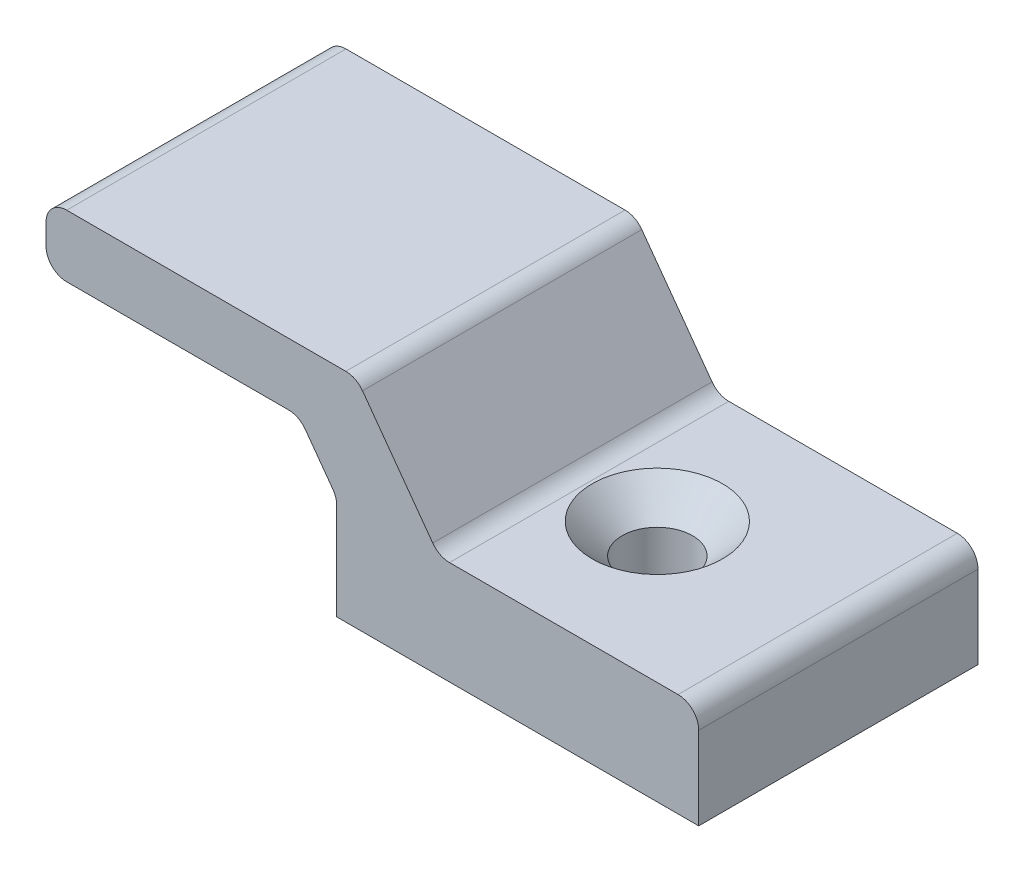
ISO-10303-21;
HEADER;
FILE_DESCRIPTION(('STEP AP214'),'2;1');
FILE_NAME('part.step','',(''),(''),'','','');
FILE_SCHEMA(('AUTOMOTIVE_DESIGN { 1 0 10303 214 1 1 1 1 }'));
ENDSEC;
DATA;
#1=APPLICATION_CONTEXT('core data for automotive mechanical design processes');
#2=APPLICATION_PROTOCOL_DEFINITION('international standard','automotive_design',2000,#1);
#3=PRODUCT_CONTEXT('',#1,'mechanical');
#4=PRODUCT('Part','Part','',(#3));
#5=PRODUCT_RELATED_PRODUCT_CATEGORY('part','',(#4));
#6=PRODUCT_DEFINITION_FORMATION('','',#4);
#7=PRODUCT_DEFINITION_CONTEXT('part definition',#1,'design');
#8=PRODUCT_DEFINITION('design','',#6,#7);
#9=PRODUCT_DEFINITION_SHAPE('','',#8);
#10=(LENGTH_UNIT() NAMED_UNIT(*) SI_UNIT(.MILLI.,.METRE.));
#11=(NAMED_UNIT(*) PLANE_ANGLE_UNIT() SI_UNIT($,.RADIAN.));
#12=(NAMED_UNIT(*) SI_UNIT($,.STERADIAN.) SOLID_ANGLE_UNIT());
#13=UNCERTAINTY_MEASURE_WITH_UNIT(LENGTH_MEASURE(1.E-05),#10,'distance_accuracy_value','');
#14=(GEOMETRIC_REPRESENTATION_CONTEXT(3) GLOBAL_UNCERTAINTY_ASSIGNED_CONTEXT((#13)) GLOBAL_UNIT_ASSIGNED_CONTEXT((#10,
#11,#12)) REPRESENTATION_CONTEXT('',''));
#15=CARTESIAN_POINT('',(0.,0.,0.));
#16=DIRECTION('',(0.,0.,1.));
#17=DIRECTION('',(1.,0.,0.));
#18=AXIS2_PLACEMENT_3D('',#15,#16,#17);
#19=CARTESIAN_POINT('',(8.75,5.,13.5));
#20=DIRECTION('',(-1.,0.,0.));
#21=DIRECTION('',(0.,-1.,0.));
#22=AXIS2_PLACEMENT_3D('',#19,#20,#21);
#23=PLANE('',#22);
#24=DIRECTION('',(0.,1.,0.));
#25=VECTOR('',#24,1.);
#26=CARTESIAN_POINT('',(8.75,5.,0.));
#27=LINE('',#26,#25);
#28=CARTESIAN_POINT('',(8.75,0.,0.));
#29=VERTEX_POINT('',#28);
#30=CARTESIAN_POINT('',(8.75,4.,0.));
#31=VERTEX_POINT('',#30);
#32=EDGE_CURVE('E185',#29,#31,#27,.T.);
#33=ORIENTED_EDGE('',*,*,#32,.T.);
#34=DIRECTION('',(0.,0.,-1.));
#35=VECTOR('',#34,1.);
#36=CARTESIAN_POINT('',(8.75,4.,13.5));
#37=LINE('',#36,#35);
#38=CARTESIAN_POINT('',(8.75,4.,13.5));
#39=VERTEX_POINT('',#38);
#40=EDGE_CURVE('E277',#31,#39,#37,.F.);
#41=ORIENTED_EDGE('',*,*,#40,.T.);
#42=DIRECTION('',(0.,1.,0.));
#43=VECTOR('',#42,1.);
#44=CARTESIAN_POINT('',(8.75,5.,13.5));
#45=LINE('',#44,#43);
#46=CARTESIAN_POINT('',(8.75,0.,13.5));
#47=VERTEX_POINT('',#46);
#48=EDGE_CURVE('E217',#47,#39,#45,.T.);
#49=ORIENTED_EDGE('',*,*,#48,.F.);
#50=DIRECTION('',(0.,0.,-1.));
#51=VECTOR('',#50,1.);
#52=CARTESIAN_POINT('',(8.75,0.,13.5));
#53=LINE('',#52,#51);
#54=EDGE_CURVE('E174',#47,#29,#53,.T.);
#55=ORIENTED_EDGE('',*,*,#54,.T.);
#56=EDGE_LOOP('',(#33,#41,#49,#55));
#57=FACE_BOUND('',#56,.T.);
#58=ADVANCED_FACE('F39',(#57),#23,.F.);
#59=CARTESIAN_POINT('',(-3.80700582833205,5.,13.5));
#60=DIRECTION('',(0.,-1.,0.));
#61=DIRECTION('',(0.,0.,-1.));
#62=AXIS2_PLACEMENT_3D('',#59,#60,#61);
#63=PLANE('',#62);
#64=CARTESIAN_POINT('',(0.,5.00000000000001,6.75));
#65=DIRECTION('',(0.,1.,0.));
#66=DIRECTION('',(0.,0.,1.));
#67=AXIS2_PLACEMENT_3D('',#64,#65,#66);
#68=CIRCLE('',#67,3.15);
#69=CARTESIAN_POINT('',(0.,5.00000000000001,9.9));
#70=VERTEX_POINT('',#69);
#71=EDGE_CURVE('E357',#70,#70,#68,.T.);
#72=ORIENTED_EDGE('',*,*,#71,.F.);
#73=EDGE_LOOP('',(#72));
#74=FACE_BOUND('',#73,.T.);
#75=DIRECTION('',(-1.,0.,0.));
#76=VECTOR('',#75,1.);
#77=CARTESIAN_POINT('',(-3.80700582833205,5.,13.5));
#78=LINE('',#77,#76);
#79=CARTESIAN_POINT('',(7.74999999999999,5.,13.5));
#80=VERTEX_POINT('',#79);
#81=CARTESIAN_POINT('',(-3.29725622571832,5.,13.5));
#82=VERTEX_POINT('',#81);
#83=EDGE_CURVE('E318',#80,#82,#78,.T.);
#84=ORIENTED_EDGE('',*,*,#83,.F.);
#85=DIRECTION('',(0.,0.,-1.));
#86=VECTOR('',#85,1.);
#87=CARTESIAN_POINT('',(7.75,5.,13.5));
#88=LINE('',#87,#86);
#89=CARTESIAN_POINT('',(7.74999999999999,5.,0.));
#90=VERTEX_POINT('',#89);
#91=EDGE_CURVE('E273',#80,#90,#88,.T.);
#92=ORIENTED_EDGE('',*,*,#91,.T.);
#93=DIRECTION('',(-1.,0.,0.));
#94=VECTOR('',#93,1.);
#95=CARTESIAN_POINT('',(-3.80700582833205,5.,0.));
#96=LINE('',#95,#94);
#97=CARTESIAN_POINT('',(-3.29725622571832,5.,0.));
#98=VERTEX_POINT('',#97);
#99=EDGE_CURVE('E189',#90,#98,#96,.T.);
#100=ORIENTED_EDGE('',*,*,#99,.T.);
#101=DIRECTION('',(0.,0.,-1.));
#102=VECTOR('',#101,1.);
#103=CARTESIAN_POINT('',(-3.29725622571832,5.,13.5));
#104=LINE('',#103,#102);
#105=EDGE_CURVE('E270',#98,#82,#104,.F.);
#106=ORIENTED_EDGE('',*,*,#105,.T.);
#107=EDGE_LOOP('',(#84,#92,#100,#106));
#108=FACE_BOUND('',#107,.T.);
#109=ADVANCED_FACE('F310',(#74,#108),#63,.F.);
#110=CARTESIAN_POINT('',(-7.80000000000001,10.5,13.5));
#111=DIRECTION('',(-0.809226121067879,-0.587497306361003,0.));
#112=DIRECTION('',(0.587497306361003,-0.809226121067879,0.));
#113=AXIS2_PLACEMENT_3D('',#110,#111,#112);
#114=PLANE('',#113);
#115=DIRECTION('',(-0.587497306361003,0.809226121067879,0.));
#116=VECTOR('',#115,1.);
#117=CARTESIAN_POINT('',(-7.80000000000001,10.5,0.));
#118=LINE('',#117,#116);
#119=CARTESIAN_POINT('',(-4.1064823467862,5.412502693639,0.));
#120=VERTEX_POINT('',#119);
#121=CARTESIAN_POINT('',(-7.50052348154585,10.087497306361,0.));
#122=VERTEX_POINT('',#121);
#123=EDGE_CURVE('E194',#120,#122,#118,.T.);
#124=ORIENTED_EDGE('',*,*,#123,.T.);
#125=DIRECTION('',(0.,0.,-1.));
#126=VECTOR('',#125,1.);
#127=CARTESIAN_POINT('',(-7.50052348154585,10.087497306361,13.5));
#128=LINE('',#127,#126);
#129=CARTESIAN_POINT('',(-7.50052348154585,10.087497306361,13.5));
#130=VERTEX_POINT('',#129);
#131=EDGE_CURVE('E267',#122,#130,#128,.F.);
#132=ORIENTED_EDGE('',*,*,#131,.T.);
#133=DIRECTION('',(-0.587497306361003,0.809226121067879,0.));
#134=VECTOR('',#133,1.);
#135=CARTESIAN_POINT('',(-7.80000000000001,10.5,13.5));
#136=LINE('',#135,#134);
#137=CARTESIAN_POINT('',(-4.1064823467862,5.412502693639,13.5));
#138=VERTEX_POINT('',#137);
#139=EDGE_CURVE('E316',#138,#130,#136,.T.);
#140=ORIENTED_EDGE('',*,*,#139,.F.);
#141=DIRECTION('',(0.,0.,-1.));
#142=VECTOR('',#141,1.);
#143=CARTESIAN_POINT('',(-4.1064823467862,5.412502693639,0.));
#144=LINE('',#143,#142);
#145=EDGE_CURVE('E263',#138,#120,#144,.T.);
#146=ORIENTED_EDGE('',*,*,#145,.T.);
#147=EDGE_LOOP('',(#124,#132,#140,#146));
#148=FACE_BOUND('',#147,.T.);
#149=ADVANCED_FACE('F320',(#148),#114,.F.);
#150=CARTESIAN_POINT('',(-22.8,10.5,13.5));
#151=DIRECTION('',(0.,-1.,0.));
#152=DIRECTION('',(1.,0.,0.));
#153=AXIS2_PLACEMENT_3D('',#150,#151,#152);
#154=PLANE('',#153);
#155=DIRECTION('',(-1.,0.,0.));
#156=VECTOR('',#155,1.);
#157=CARTESIAN_POINT('',(-22.8,10.5,0.));
#158=LINE('',#157,#156);
#159=CARTESIAN_POINT('',(-8.30974960261373,10.5,0.));
#160=VERTEX_POINT('',#159);
#161=CARTESIAN_POINT('',(-21.8,10.5,0.));
#162=VERTEX_POINT('',#161);
#163=EDGE_CURVE('E198',#160,#162,#158,.T.);
#164=ORIENTED_EDGE('',*,*,#163,.T.);
#165=DIRECTION('',(0.,0.,-1.));
#166=VECTOR('',#165,1.);
#167=CARTESIAN_POINT('',(-21.8,10.5,13.5));
#168=LINE('',#167,#166);
#169=CARTESIAN_POINT('',(-21.8,10.5,13.5));
#170=VERTEX_POINT('',#169);
#171=EDGE_CURVE('E260',#162,#170,#168,.F.);
#172=ORIENTED_EDGE('',*,*,#171,.T.);
#173=DIRECTION('',(-1.,0.,0.));
#174=VECTOR('',#173,1.);
#175=CARTESIAN_POINT('',(-22.8,10.5,13.5));
#176=LINE('',#175,#174);
#177=CARTESIAN_POINT('',(-8.30974960261373,10.5,13.5));
#178=VERTEX_POINT('',#177);
#179=EDGE_CURVE('E323',#178,#170,#176,.T.);
#180=ORIENTED_EDGE('',*,*,#179,.F.);
#181=DIRECTION('',(0.,0.,-1.));
#182=VECTOR('',#181,1.);
#183=CARTESIAN_POINT('',(-8.30974960261373,10.5,13.5));
#184=LINE('',#183,#182);
#185=EDGE_CURVE('E256',#178,#160,#184,.T.);
#186=ORIENTED_EDGE('',*,*,#185,.T.);
#187=EDGE_LOOP('',(#164,#172,#180,#186));
#188=FACE_BOUND('',#187,.T.);
#189=ADVANCED_FACE('F370',(#188),#154,.F.);
#190=CARTESIAN_POINT('',(-22.8,7.5,13.5));
#191=DIRECTION('',(1.,0.,0.));
#192=DIRECTION('',(0.,0.,-1.));
#193=AXIS2_PLACEMENT_3D('',#190,#191,#192);
#194=PLANE('',#193);
#195=DIRECTION('',(0.,-1.,0.));
#196=VECTOR('',#195,1.);
#197=CARTESIAN_POINT('',(-22.8,7.5,0.));
#198=LINE('',#197,#196);
#199=CARTESIAN_POINT('',(-22.8,9.5,0.));
#200=VERTEX_POINT('',#199);
#201=CARTESIAN_POINT('',(-22.8,8.5,0.));
#202=VERTEX_POINT('',#201);
#203=EDGE_CURVE('E202',#200,#202,#198,.T.);
#204=ORIENTED_EDGE('',*,*,#203,.T.);
#205=DIRECTION('',(0.,0.,-1.));
#206=VECTOR('',#205,1.);
#207=CARTESIAN_POINT('',(-22.8,8.5,13.5));
#208=LINE('',#207,#206);
#209=CARTESIAN_POINT('',(-22.8,8.5,13.5));
#210=VERTEX_POINT('',#209);
#211=EDGE_CURVE('E241',#202,#210,#208,.F.);
#212=ORIENTED_EDGE('',*,*,#211,.T.);
#213=DIRECTION('',(0.,-1.,0.));
#214=VECTOR('',#213,1.);
#215=CARTESIAN_POINT('',(-22.8,7.5,13.5));
#216=LINE('',#215,#214);
#217=CARTESIAN_POINT('',(-22.8,9.5,13.5));
#218=VERTEX_POINT('',#217);
#219=EDGE_CURVE('E328',#218,#210,#216,.T.);
#220=ORIENTED_EDGE('',*,*,#219,.F.);
#221=DIRECTION('',(0.,0.,-1.));
#222=VECTOR('',#221,1.);
#223=CARTESIAN_POINT('',(-22.8,9.5,13.5));
#224=LINE('',#223,#222);
#225=EDGE_CURVE('E237',#218,#200,#224,.T.);
#226=ORIENTED_EDGE('',*,*,#225,.T.);
#227=EDGE_LOOP('',(#204,#212,#220,#226));
#228=FACE_BOUND('',#227,.T.);
#229=ADVANCED_FACE('F409',(#228),#194,.F.);
#230=CARTESIAN_POINT('',(-10.5649973507582,7.5,13.5));
#231=DIRECTION('',(0.,1.,0.));
#232=DIRECTION('',(-1.,0.,0.));
#233=AXIS2_PLACEMENT_3D('',#230,#231,#232);
#234=PLANE('',#233);
#235=DIRECTION('',(1.,0.,0.));
#236=VECTOR('',#235,1.);
#237=CARTESIAN_POINT('',(-10.5649973507582,7.5,13.5));
#238=LINE('',#237,#236);
#239=CARTESIAN_POINT('',(-21.8,7.5,13.5));
#240=VERTEX_POINT('',#239);
#241=CARTESIAN_POINT('',(-11.0747469533719,7.5,13.5));
#242=VERTEX_POINT('',#241);
#243=EDGE_CURVE('E335',#240,#242,#238,.T.);
#244=ORIENTED_EDGE('',*,*,#243,.F.);
#245=DIRECTION('',(0.,0.,-1.));
#246=VECTOR('',#245,1.);
#247=CARTESIAN_POINT('',(-21.8,7.5,13.5));
#248=LINE('',#247,#246);
#249=CARTESIAN_POINT('',(-21.8,7.5,0.));
#250=VERTEX_POINT('',#249);
#251=EDGE_CURVE('E221',#240,#250,#248,.T.);
#252=ORIENTED_EDGE('',*,*,#251,.T.);
#253=DIRECTION('',(1.,0.,0.));
#254=VECTOR('',#253,1.);
#255=CARTESIAN_POINT('',(-10.5649973507582,7.5,0.));
#256=LINE('',#255,#254);
#257=CARTESIAN_POINT('',(-11.0747469533719,7.5,0.));
#258=VERTEX_POINT('',#257);
#259=EDGE_CURVE('E206',#250,#258,#256,.T.);
#260=ORIENTED_EDGE('',*,*,#259,.T.);
#261=DIRECTION('',(0.,0.,-1.));
#262=VECTOR('',#261,1.);
#263=CARTESIAN_POINT('',(-11.0747469533719,7.5,13.5));
#264=LINE('',#263,#262);
#265=EDGE_CURVE('E173',#258,#242,#264,.F.);
#266=ORIENTED_EDGE('',*,*,#265,.T.);
#267=EDGE_LOOP('',(#244,#252,#260,#266));
#268=FACE_BOUND('',#267,.T.);
#269=ADVANCED_FACE('F403',(#268),#234,.F.);
#270=CARTESIAN_POINT('',(-8.75,5.,13.5));
#271=DIRECTION('',(0.80922612106788,0.587497306361002,0.));
#272=DIRECTION('',(-0.587497306361002,0.80922612106788,0.));
#273=AXIS2_PLACEMENT_3D('',#270,#271,#272);
#274=PLANE('',#273);
#275=DIRECTION('',(0.587497306361002,-0.80922612106788,0.));
#276=VECTOR('',#275,1.);
#277=CARTESIAN_POINT('',(-8.75,5.,0.));
#278=LINE('',#277,#276);
#279=CARTESIAN_POINT('',(-10.265520832304,7.087497306361,0.));
#280=VERTEX_POINT('',#279);
#281=CARTESIAN_POINT('',(-8.94077387893212,5.26277432147825,0.));
#282=VERTEX_POINT('',#281);
#283=EDGE_CURVE('E210',#280,#282,#278,.T.);
#284=ORIENTED_EDGE('',*,*,#283,.T.);
#285=DIRECTION('',(0.,0.,-1.));
#286=VECTOR('',#285,1.);
#287=CARTESIAN_POINT('',(-8.94077387893212,5.26277432147825,13.5));
#288=LINE('',#287,#286);
#289=CARTESIAN_POINT('',(-8.94077387893212,5.26277432147825,13.5));
#290=VERTEX_POINT('',#289);
#291=EDGE_CURVE('E63',#282,#290,#288,.F.);
#292=ORIENTED_EDGE('',*,*,#291,.T.);
#293=DIRECTION('',(0.587497306361002,-0.80922612106788,0.));
#294=VECTOR('',#293,1.);
#295=CARTESIAN_POINT('',(-8.75,5.,13.5));
#296=LINE('',#295,#294);
#297=CARTESIAN_POINT('',(-10.265520832304,7.087497306361,13.5));
#298=VERTEX_POINT('',#297);
#299=EDGE_CURVE('E163',#298,#290,#296,.T.);
#300=ORIENTED_EDGE('',*,*,#299,.F.);
#301=DIRECTION('',(0.,0.,-1.));
#302=VECTOR('',#301,1.);
#303=CARTESIAN_POINT('',(-10.265520832304,7.087497306361,0.));
#304=LINE('',#303,#302);
#305=EDGE_CURVE('E283',#298,#280,#304,.T.);
#306=ORIENTED_EDGE('',*,*,#305,.T.);
#307=EDGE_LOOP('',(#284,#292,#300,#306));
#308=FACE_BOUND('',#307,.T.);
#309=ADVANCED_FACE('F400',(#308),#274,.F.);
#310=CARTESIAN_POINT('',(-8.75,0.,13.5));
#311=DIRECTION('',(1.,0.,0.));
#312=DIRECTION('',(0.,1.,0.));
#313=AXIS2_PLACEMENT_3D('',#310,#311,#312);
#314=PLANE('',#313);
#315=DIRECTION('',(0.,-1.,0.));
#316=VECTOR('',#315,1.);
#317=CARTESIAN_POINT('',(-8.75,0.,13.5));
#318=LINE('',#317,#316);
#319=CARTESIAN_POINT('',(-8.75,4.67527701511725,13.5));
#320=VERTEX_POINT('',#319);
#321=CARTESIAN_POINT('',(-8.75,0.,13.5));
#322=VERTEX_POINT('',#321);
#323=EDGE_CURVE('E151',#320,#322,#318,.T.);
#324=ORIENTED_EDGE('',*,*,#323,.F.);
#325=DIRECTION('',(0.,0.,-1.));
#326=VECTOR('',#325,1.);
#327=CARTESIAN_POINT('',(-8.75,4.67527701511725,0.));
#328=LINE('',#327,#326);
#329=CARTESIAN_POINT('',(-8.75,4.67527701511725,0.));
#330=VERTEX_POINT('',#329);
#331=EDGE_CURVE('E280',#320,#330,#328,.T.);
#332=ORIENTED_EDGE('',*,*,#331,.T.);
#333=DIRECTION('',(0.,-1.,0.));
#334=VECTOR('',#333,1.);
#335=CARTESIAN_POINT('',(-8.75,0.,0.));
#336=LINE('',#335,#334);
#337=CARTESIAN_POINT('',(-8.75,0.,0.));
#338=VERTEX_POINT('',#337);
#339=EDGE_CURVE('E169',#330,#338,#336,.T.);
#340=ORIENTED_EDGE('',*,*,#339,.T.);
#341=DIRECTION('',(0.,0.,-1.));
#342=VECTOR('',#341,1.);
#343=CARTESIAN_POINT('',(-8.75,0.,13.5));
#344=LINE('',#343,#342);
#345=EDGE_CURVE('E166',#322,#338,#344,.T.);
#346=ORIENTED_EDGE('',*,*,#345,.F.);
#347=EDGE_LOOP('',(#324,#332,#340,#346));
#348=FACE_BOUND('',#347,.T.);
#349=ADVANCED_FACE('F167',(#348),#314,.F.);
#350=CARTESIAN_POINT('',(8.75,0.,13.5));
#351=DIRECTION('',(0.,1.,0.));
#352=DIRECTION('',(-1.,0.,0.));
#353=AXIS2_PLACEMENT_3D('',#350,#351,#352);
#354=PLANE('',#353);
#355=CARTESIAN_POINT('',(0.,0.,6.75));
#356=DIRECTION('',(0.,1.,0.));
#357=DIRECTION('',(0.,0.,1.));
#358=AXIS2_PLACEMENT_3D('',#355,#356,#357);
#359=CIRCLE('',#358,1.7);
#360=CARTESIAN_POINT('',(0.,0.,8.45));
#361=VERTEX_POINT('',#360);
#362=EDGE_CURVE('E190',#361,#361,#359,.T.);
#363=ORIENTED_EDGE('',*,*,#362,.T.);
#364=EDGE_LOOP('',(#363));
#365=FACE_BOUND('',#364,.T.);
#366=DIRECTION('',(1.,0.,0.));
#367=VECTOR('',#366,1.);
#368=CARTESIAN_POINT('',(8.75,0.,0.));
#369=LINE('',#368,#367);
#370=EDGE_CURVE('E215',#338,#29,#369,.T.);
#371=ORIENTED_EDGE('',*,*,#370,.T.);
#372=ORIENTED_EDGE('',*,*,#54,.F.);
#373=DIRECTION('',(1.,0.,0.));
#374=VECTOR('',#373,1.);
#375=CARTESIAN_POINT('',(8.75,0.,13.5));
#376=LINE('',#375,#374);
#377=EDGE_CURVE('E157',#322,#47,#376,.T.);
#378=ORIENTED_EDGE('',*,*,#377,.F.);
#379=ORIENTED_EDGE('',*,*,#345,.T.);
#380=EDGE_LOOP('',(#371,#372,#378,#379));
#381=FACE_BOUND('',#380,.T.);
#382=ADVANCED_FACE('F176',(#365,#381),#354,.F.);
#383=CARTESIAN_POINT('',(0.,0.,13.5));
#384=DIRECTION('',(0.,0.,-1.));
#385=DIRECTION('',(-1.,0.,0.));
#386=AXIS2_PLACEMENT_3D('',#383,#384,#385);
#387=PLANE('',#386);
#388=ORIENTED_EDGE('',*,*,#219,.T.);
#389=CARTESIAN_POINT('',(-21.8,8.5,13.5));
#390=DIRECTION('',(0.,0.,-1.));
#391=DIRECTION('',(-1.,0.,0.));
#392=AXIS2_PLACEMENT_3D('',#389,#390,#391);
#393=CIRCLE('',#392,1.);
#394=EDGE_CURVE('E253',#210,#240,#393,.F.);
#395=ORIENTED_EDGE('',*,*,#394,.T.);
#396=ORIENTED_EDGE('',*,*,#243,.T.);
#397=CARTESIAN_POINT('',(-11.0747469533719,6.5,13.5));
#398=DIRECTION('',(0.,0.,-1.));
#399=DIRECTION('',(-1.,0.,0.));
#400=AXIS2_PLACEMENT_3D('',#397,#398,#399);
#401=CIRCLE('',#400,1.);
#402=EDGE_CURVE('E297',#242,#298,#401,.T.);
#403=ORIENTED_EDGE('',*,*,#402,.T.);
#404=ORIENTED_EDGE('',*,*,#299,.T.);
#405=CARTESIAN_POINT('',(-9.75,4.67527701511725,13.5));
#406=DIRECTION('',(0.,0.,-1.));
#407=DIRECTION('',(-1.,0.,0.));
#408=AXIS2_PLACEMENT_3D('',#405,#406,#407);
#409=CIRCLE('',#408,1.);
#410=EDGE_CURVE('E55',#290,#320,#409,.T.);
#411=ORIENTED_EDGE('',*,*,#410,.T.);
#412=ORIENTED_EDGE('',*,*,#323,.T.);
#413=ORIENTED_EDGE('',*,*,#377,.T.);
#414=ORIENTED_EDGE('',*,*,#48,.T.);
#415=CARTESIAN_POINT('',(7.75,4.,13.5));
#416=DIRECTION('',(0.,0.,-1.));
#417=DIRECTION('',(-1.,0.,0.));
#418=AXIS2_PLACEMENT_3D('',#415,#416,#417);
#419=CIRCLE('',#418,1.);
#420=EDGE_CURVE('E244',#39,#80,#419,.F.);
#421=ORIENTED_EDGE('',*,*,#420,.T.);
#422=ORIENTED_EDGE('',*,*,#83,.T.);
#423=CARTESIAN_POINT('',(-3.29725622571832,6.,13.5));
#424=DIRECTION('',(0.,0.,-1.));
#425=DIRECTION('',(-1.,0.,0.));
#426=AXIS2_PLACEMENT_3D('',#423,#424,#425);
#427=CIRCLE('',#426,1.);
#428=EDGE_CURVE('E11',#82,#138,#427,.T.);
#429=ORIENTED_EDGE('',*,*,#428,.T.);
#430=ORIENTED_EDGE('',*,*,#139,.T.);
#431=CARTESIAN_POINT('',(-8.30974960261373,9.5,13.5));
#432=DIRECTION('',(0.,0.,-1.));
#433=DIRECTION('',(-1.,0.,0.));
#434=AXIS2_PLACEMENT_3D('',#431,#432,#433);
#435=CIRCLE('',#434,1.);
#436=EDGE_CURVE('E247',#130,#178,#435,.F.);
#437=ORIENTED_EDGE('',*,*,#436,.T.);
#438=ORIENTED_EDGE('',*,*,#179,.T.);
#439=CARTESIAN_POINT('',(-21.8,9.5,13.5));
#440=DIRECTION('',(0.,0.,-1.));
#441=DIRECTION('',(-1.,0.,0.));
#442=AXIS2_PLACEMENT_3D('',#439,#440,#441);
#443=CIRCLE('',#442,1.);
#444=EDGE_CURVE('E250',#170,#218,#443,.F.);
#445=ORIENTED_EDGE('',*,*,#444,.T.);
#446=EDGE_LOOP('',(#388,#395,#396,#403,#404,#411,#412,#413,#414,#421,#422,#429,#430,#437,#438,#445));
#447=FACE_BOUND('',#446,.T.);
#448=ADVANCED_FACE('F154',(#447),#387,.F.);
#449=CARTESIAN_POINT('',(0.,0.,0.));
#450=DIRECTION('',(0.,0.,-1.));
#451=DIRECTION('',(-1.,0.,0.));
#452=AXIS2_PLACEMENT_3D('',#449,#450,#451);
#453=PLANE('',#452);
#454=ORIENTED_EDGE('',*,*,#259,.F.);
#455=CARTESIAN_POINT('',(-21.8,8.5,0.));
#456=DIRECTION('',(0.,0.,-1.));
#457=DIRECTION('',(-1.,0.,0.));
#458=AXIS2_PLACEMENT_3D('',#455,#456,#457);
#459=CIRCLE('',#458,1.);
#460=EDGE_CURVE('E234',#250,#202,#459,.T.);
#461=ORIENTED_EDGE('',*,*,#460,.T.);
#462=ORIENTED_EDGE('',*,*,#203,.F.);
#463=CARTESIAN_POINT('',(-21.8,9.5,0.));
#464=DIRECTION('',(0.,0.,-1.));
#465=DIRECTION('',(-1.,0.,0.));
#466=AXIS2_PLACEMENT_3D('',#463,#464,#465);
#467=CIRCLE('',#466,1.);
#468=EDGE_CURVE('E231',#200,#162,#467,.T.);
#469=ORIENTED_EDGE('',*,*,#468,.T.);
#470=ORIENTED_EDGE('',*,*,#163,.F.);
#471=CARTESIAN_POINT('',(-8.30974960261373,9.5,0.));
#472=DIRECTION('',(0.,0.,-1.));
#473=DIRECTION('',(-1.,0.,0.));
#474=AXIS2_PLACEMENT_3D('',#471,#472,#473);
#475=CIRCLE('',#474,1.);
#476=EDGE_CURVE('E228',#160,#122,#475,.T.);
#477=ORIENTED_EDGE('',*,*,#476,.T.);
#478=ORIENTED_EDGE('',*,*,#123,.F.);
#479=CARTESIAN_POINT('',(-3.29725622571832,6.,0.));
#480=DIRECTION('',(0.,0.,-1.));
#481=DIRECTION('',(-1.,0.,0.));
#482=AXIS2_PLACEMENT_3D('',#479,#480,#481);
#483=CIRCLE('',#482,1.);
#484=EDGE_CURVE('E48',#120,#98,#483,.F.);
#485=ORIENTED_EDGE('',*,*,#484,.T.);
#486=ORIENTED_EDGE('',*,*,#99,.F.);
#487=CARTESIAN_POINT('',(7.75,4.,0.));
#488=DIRECTION('',(0.,0.,-1.));
#489=DIRECTION('',(-1.,0.,0.));
#490=AXIS2_PLACEMENT_3D('',#487,#488,#489);
#491=CIRCLE('',#490,1.);
#492=EDGE_CURVE('E225',#90,#31,#491,.T.);
#493=ORIENTED_EDGE('',*,*,#492,.T.);
#494=ORIENTED_EDGE('',*,*,#32,.F.);
#495=ORIENTED_EDGE('',*,*,#370,.F.);
#496=ORIENTED_EDGE('',*,*,#339,.F.);
#497=CARTESIAN_POINT('',(-9.75,4.67527701511725,0.));
#498=DIRECTION('',(0.,0.,-1.));
#499=DIRECTION('',(-1.,0.,0.));
#500=AXIS2_PLACEMENT_3D('',#497,#498,#499);
#501=CIRCLE('',#500,1.);
#502=EDGE_CURVE('E289',#330,#282,#501,.F.);
#503=ORIENTED_EDGE('',*,*,#502,.T.);
#504=ORIENTED_EDGE('',*,*,#283,.F.);
#505=CARTESIAN_POINT('',(-11.0747469533719,6.5,0.));
#506=DIRECTION('',(0.,0.,-1.));
#507=DIRECTION('',(-1.,0.,0.));
#508=AXIS2_PLACEMENT_3D('',#505,#506,#507);
#509=CIRCLE('',#508,1.);
#510=EDGE_CURVE('E294',#280,#258,#509,.F.);
#511=ORIENTED_EDGE('',*,*,#510,.T.);
#512=EDGE_LOOP('',(#454,#461,#462,#469,#470,#477,#478,#485,#486,#493,#494,#495,#496,#503,#504,#511));
#513=FACE_BOUND('',#512,.T.);
#514=ADVANCED_FACE('F304',(#513),#453,.T.);
#515=CARTESIAN_POINT('',(-21.8,8.5,13.5));
#516=DIRECTION('',(0.,0.,-1.));
#517=DIRECTION('',(-1.,0.,0.));
#518=AXIS2_PLACEMENT_3D('',#515,#516,#517);
#519=CYLINDRICAL_SURFACE('',#518,1.);
#520=ORIENTED_EDGE('',*,*,#394,.F.);
#521=ORIENTED_EDGE('',*,*,#211,.F.);
#522=ORIENTED_EDGE('',*,*,#460,.F.);
#523=ORIENTED_EDGE('',*,*,#251,.F.);
#524=EDGE_LOOP('',(#520,#521,#522,#523));
#525=FACE_BOUND('',#524,.T.);
#526=ADVANCED_FACE('F375',(#525),#519,.T.);
#527=CARTESIAN_POINT('',(-21.8,9.5,13.5));
#528=DIRECTION('',(0.,0.,-1.));
#529=DIRECTION('',(-1.,0.,0.));
#530=AXIS2_PLACEMENT_3D('',#527,#528,#529);
#531=CYLINDRICAL_SURFACE('',#530,1.);
#532=ORIENTED_EDGE('',*,*,#444,.F.);
#533=ORIENTED_EDGE('',*,*,#171,.F.);
#534=ORIENTED_EDGE('',*,*,#468,.F.);
#535=ORIENTED_EDGE('',*,*,#225,.F.);
#536=EDGE_LOOP('',(#532,#533,#534,#535));
#537=FACE_BOUND('',#536,.T.);
#538=ADVANCED_FACE('F378',(#537),#531,.T.);
#539=CARTESIAN_POINT('',(-8.30974960261373,9.5,13.5));
#540=DIRECTION('',(0.,0.,-1.));
#541=DIRECTION('',(-1.,0.,0.));
#542=AXIS2_PLACEMENT_3D('',#539,#540,#541);
#543=CYLINDRICAL_SURFACE('',#542,1.);
#544=ORIENTED_EDGE('',*,*,#436,.F.);
#545=ORIENTED_EDGE('',*,*,#131,.F.);
#546=ORIENTED_EDGE('',*,*,#476,.F.);
#547=ORIENTED_EDGE('',*,*,#185,.F.);
#548=EDGE_LOOP('',(#544,#545,#546,#547));
#549=FACE_BOUND('',#548,.T.);
#550=ADVANCED_FACE('F382',(#549),#543,.T.);
#551=CARTESIAN_POINT('',(7.75,4.,13.5));
#552=DIRECTION('',(0.,0.,-1.));
#553=DIRECTION('',(-1.,0.,0.));
#554=AXIS2_PLACEMENT_3D('',#551,#552,#553);
#555=CYLINDRICAL_SURFACE('',#554,1.);
#556=ORIENTED_EDGE('',*,*,#420,.F.);
#557=ORIENTED_EDGE('',*,*,#40,.F.);
#558=ORIENTED_EDGE('',*,*,#492,.F.);
#559=ORIENTED_EDGE('',*,*,#91,.F.);
#560=EDGE_LOOP('',(#556,#557,#558,#559));
#561=FACE_BOUND('',#560,.T.);
#562=ADVANCED_FACE('F386',(#561),#555,.T.);
#563=CARTESIAN_POINT('',(-9.75,4.67527701511725,13.5));
#564=DIRECTION('',(0.,0.,1.));
#565=DIRECTION('',(1.,0.,0.));
#566=AXIS2_PLACEMENT_3D('',#563,#564,#565);
#567=CYLINDRICAL_SURFACE('',#566,1.);
#568=ORIENTED_EDGE('',*,*,#410,.F.);
#569=ORIENTED_EDGE('',*,*,#291,.F.);
#570=ORIENTED_EDGE('',*,*,#502,.F.);
#571=ORIENTED_EDGE('',*,*,#331,.F.);
#572=EDGE_LOOP('',(#568,#569,#570,#571));
#573=FACE_BOUND('',#572,.T.);
#574=ADVANCED_FACE('F342',(#573),#567,.F.);
#575=CARTESIAN_POINT('',(-11.0747469533719,6.5,13.5));
#576=DIRECTION('',(0.,0.,1.));
#577=DIRECTION('',(1.,0.,0.));
#578=AXIS2_PLACEMENT_3D('',#575,#576,#577);
#579=CYLINDRICAL_SURFACE('',#578,1.);
#580=ORIENTED_EDGE('',*,*,#402,.F.);
#581=ORIENTED_EDGE('',*,*,#265,.F.);
#582=ORIENTED_EDGE('',*,*,#510,.F.);
#583=ORIENTED_EDGE('',*,*,#305,.F.);
#584=EDGE_LOOP('',(#580,#581,#582,#583));
#585=FACE_BOUND('',#584,.T.);
#586=ADVANCED_FACE('F392',(#585),#579,.F.);
#587=CARTESIAN_POINT('',(-3.29725622571832,6.,13.5));
#588=DIRECTION('',(0.,0.,1.));
#589=DIRECTION('',(1.,0.,0.));
#590=AXIS2_PLACEMENT_3D('',#587,#588,#589);
#591=CYLINDRICAL_SURFACE('',#590,1.);
#592=ORIENTED_EDGE('',*,*,#428,.F.);
#593=ORIENTED_EDGE('',*,*,#105,.F.);
#594=ORIENTED_EDGE('',*,*,#484,.F.);
#595=ORIENTED_EDGE('',*,*,#145,.F.);
#596=EDGE_LOOP('',(#592,#593,#594,#595));
#597=FACE_BOUND('',#596,.T.);
#598=ADVANCED_FACE('F41',(#597),#591,.F.);
#599=CARTESIAN_POINT('',(0.,5.,6.75));
#600=DIRECTION('',(0.,1.,0.));
#601=DIRECTION('',(0.,0.,1.));
#602=AXIS2_PLACEMENT_3D('',#599,#600,#601);
#603=CYLINDRICAL_SURFACE('',#602,1.7);
#604=ORIENTED_EDGE('',*,*,#362,.F.);
#605=EDGE_LOOP('',(#604));
#606=FACE_BOUND('',#605,.T.);
#607=CARTESIAN_POINT('',(0.,3.55,6.75));
#608=DIRECTION('',(0.,1.,0.));
#609=DIRECTION('',(0.,0.,1.));
#610=AXIS2_PLACEMENT_3D('',#607,#608,#609);
#611=CIRCLE('',#610,1.7);
#612=CARTESIAN_POINT('',(0.,3.55,8.45));
#613=VERTEX_POINT('',#612);
#614=EDGE_CURVE('E353',#613,#613,#611,.T.);
#615=ORIENTED_EDGE('',*,*,#614,.T.);
#616=EDGE_LOOP('',(#615));
#617=FACE_BOUND('',#616,.T.);
#618=ADVANCED_FACE('F398',(#606,#617),#603,.F.);
#619=CARTESIAN_POINT('',(0.,5.00000000000001,6.75));
#620=DIRECTION('',(0.,1.,0.));
#621=DIRECTION('',(0.,0.,1.));
#622=AXIS2_PLACEMENT_3D('',#619,#620,#621);
#623=CONICAL_SURFACE('',#622,3.15,0.785398163397448);
#624=ORIENTED_EDGE('',*,*,#614,.F.);
#625=EDGE_LOOP('',(#624));
#626=FACE_BOUND('',#625,.T.);
#627=ORIENTED_EDGE('',*,*,#71,.T.);
#628=EDGE_LOOP('',(#627));
#629=FACE_BOUND('',#628,.T.);
#630=ADVANCED_FACE('F362',(#626,#629),#623,.F.);
#631=CLOSED_SHELL('',(#58,#109,#149,#189,#229,#269,#309,#349,#382,#448,#514,#526,#538,#550,#562,
#574,#586,#598,#618,#630));
#632=MANIFOLD_SOLID_BREP('B2',#631);
#633=ADVANCED_BREP_SHAPE_REPRESENTATION('',(#18,#632),#14);
#634=SHAPE_DEFINITION_REPRESENTATION(#9,#633);
ENDSEC;
END-ISO-10303-21;
